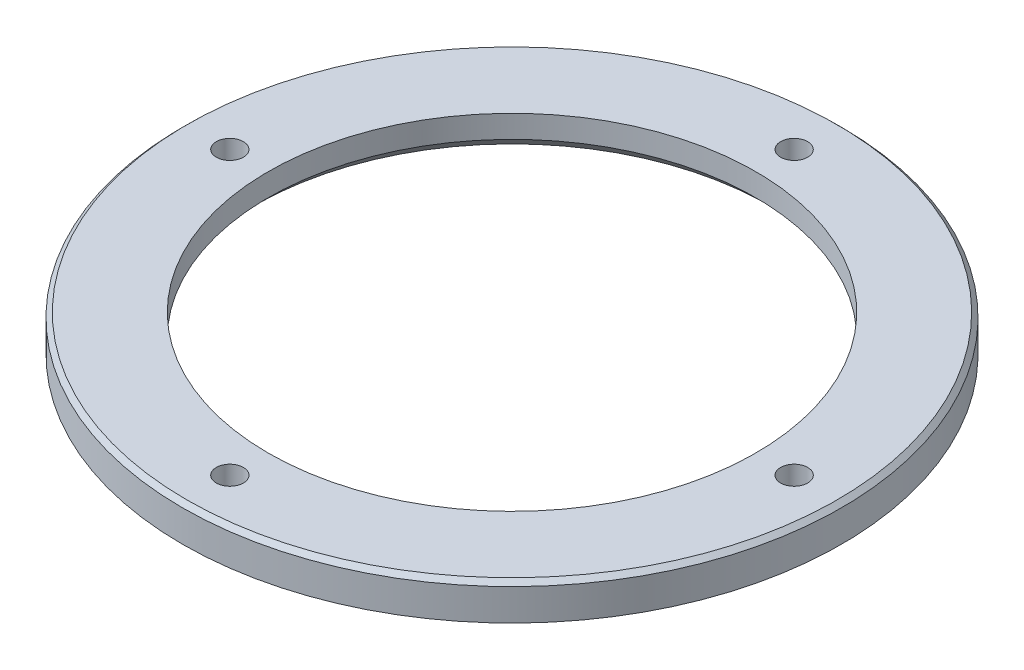
ISO-10303-21;
HEADER;
FILE_DESCRIPTION(('STEP AP214'),'2;1');
FILE_NAME('part.step','',(''),(''),'','','');
FILE_SCHEMA(('AUTOMOTIVE_DESIGN { 1 0 10303 214 1 1 1 1 }'));
ENDSEC;
DATA;
#1=APPLICATION_CONTEXT('core data for automotive mechanical design processes');
#2=APPLICATION_PROTOCOL_DEFINITION('international standard','automotive_design',2000,#1);
#3=PRODUCT_CONTEXT('',#1,'mechanical');
#4=PRODUCT('Part','Part','',(#3));
#5=PRODUCT_RELATED_PRODUCT_CATEGORY('part','',(#4));
#6=PRODUCT_DEFINITION_FORMATION('','',#4);
#7=PRODUCT_DEFINITION_CONTEXT('part definition',#1,'design');
#8=PRODUCT_DEFINITION('design','',#6,#7);
#9=PRODUCT_DEFINITION_SHAPE('','',#8);
#10=(LENGTH_UNIT() NAMED_UNIT(*) SI_UNIT(.MILLI.,.METRE.));
#11=(NAMED_UNIT(*) PLANE_ANGLE_UNIT() SI_UNIT($,.RADIAN.));
#12=(NAMED_UNIT(*) SI_UNIT($,.STERADIAN.) SOLID_ANGLE_UNIT());
#13=UNCERTAINTY_MEASURE_WITH_UNIT(LENGTH_MEASURE(1.E-05),#10,'distance_accuracy_value','');
#14=(GEOMETRIC_REPRESENTATION_CONTEXT(3) GLOBAL_UNCERTAINTY_ASSIGNED_CONTEXT((#13)) GLOBAL_UNIT_ASSIGNED_CONTEXT((#10,
#11,#12)) REPRESENTATION_CONTEXT('',''));
#15=CARTESIAN_POINT('',(0.,0.,0.));
#16=DIRECTION('',(0.,0.,1.));
#17=DIRECTION('',(1.,0.,0.));
#18=AXIS2_PLACEMENT_3D('',#15,#16,#17);
#19=CARTESIAN_POINT('',(0.,8.,0.));
#20=DIRECTION('',(0.,1.,0.));
#21=DIRECTION('',(0.,0.,1.));
#22=AXIS2_PLACEMENT_3D('',#19,#20,#21);
#23=PLANE('',#22);
#24=CARTESIAN_POINT('',(0.,8.,0.));
#25=DIRECTION('',(0.,1.,0.));
#26=DIRECTION('',(0.,0.,1.));
#27=AXIS2_PLACEMENT_3D('',#24,#25,#26);
#28=CIRCLE('',#27,72.);
#29=CARTESIAN_POINT('',(0.,8.,72.));
#30=VERTEX_POINT('',#29);
#31=EDGE_CURVE('E48',#30,#30,#28,.T.);
#32=ORIENTED_EDGE('',*,*,#31,.T.);
#33=EDGE_LOOP('',(#32));
#34=FACE_BOUND('',#33,.T.);
#35=CARTESIAN_POINT('',(62.5,8.,0.));
#36=DIRECTION('',(0.,1.,0.));
#37=DIRECTION('',(0.,0.,1.));
#38=AXIS2_PLACEMENT_3D('',#35,#36,#37);
#39=CIRCLE('',#38,3.);
#40=CARTESIAN_POINT('',(62.5,8.,3.));
#41=VERTEX_POINT('',#40);
#42=EDGE_CURVE('E58',#41,#41,#39,.T.);
#43=ORIENTED_EDGE('',*,*,#42,.F.);
#44=EDGE_LOOP('',(#43));
#45=FACE_BOUND('',#44,.T.);
#46=CARTESIAN_POINT('',(0.,8.,62.5));
#47=DIRECTION('',(0.,1.,0.));
#48=DIRECTION('',(0.,0.,1.));
#49=AXIS2_PLACEMENT_3D('',#46,#47,#48);
#50=CIRCLE('',#49,3.);
#51=CARTESIAN_POINT('',(0.,8.,65.5));
#52=VERTEX_POINT('',#51);
#53=EDGE_CURVE('E57',#52,#52,#50,.T.);
#54=ORIENTED_EDGE('',*,*,#53,.F.);
#55=EDGE_LOOP('',(#54));
#56=FACE_BOUND('',#55,.T.);
#57=CARTESIAN_POINT('',(0.,8.,-62.5));
#58=DIRECTION('',(0.,1.,0.));
#59=DIRECTION('',(0.,0.,1.));
#60=AXIS2_PLACEMENT_3D('',#57,#58,#59);
#61=CIRCLE('',#60,3.);
#62=CARTESIAN_POINT('',(0.,8.,-59.5));
#63=VERTEX_POINT('',#62);
#64=EDGE_CURVE('E62',#63,#63,#61,.T.);
#65=ORIENTED_EDGE('',*,*,#64,.F.);
#66=EDGE_LOOP('',(#65));
#67=FACE_BOUND('',#66,.T.);
#68=CARTESIAN_POINT('',(-62.5,8.,0.));
#69=DIRECTION('',(0.,1.,0.));
#70=DIRECTION('',(0.,0.,1.));
#71=AXIS2_PLACEMENT_3D('',#68,#69,#70);
#72=CIRCLE('',#71,3.00000000000001);
#73=CARTESIAN_POINT('',(-62.5,8.,3.00000000000001));
#74=VERTEX_POINT('',#73);
#75=EDGE_CURVE('E66',#74,#74,#72,.T.);
#76=ORIENTED_EDGE('',*,*,#75,.F.);
#77=EDGE_LOOP('',(#76));
#78=FACE_BOUND('',#77,.T.);
#79=CARTESIAN_POINT('',(0.,8.,0.));
#80=DIRECTION('',(0.,1.,0.));
#81=DIRECTION('',(0.,0.,1.));
#82=AXIS2_PLACEMENT_3D('',#79,#80,#81);
#83=CIRCLE('',#82,54.);
#84=CARTESIAN_POINT('',(0.,8.,54.));
#85=VERTEX_POINT('',#84);
#86=EDGE_CURVE('E70',#85,#85,#83,.T.);
#87=ORIENTED_EDGE('',*,*,#86,.F.);
#88=EDGE_LOOP('',(#87));
#89=FACE_BOUND('',#88,.T.);
#90=ADVANCED_FACE('F33',(#34,#45,#56,#67,#78,#89),#23,.T.);
#91=CARTESIAN_POINT('',(0.,0.,0.));
#92=DIRECTION('',(0.,1.,0.));
#93=DIRECTION('',(0.,0.,1.));
#94=AXIS2_PLACEMENT_3D('',#91,#92,#93);
#95=PLANE('',#94);
#96=CARTESIAN_POINT('',(0.,0.,0.));
#97=DIRECTION('',(0.,1.,0.));
#98=DIRECTION('',(0.,0.,1.));
#99=AXIS2_PLACEMENT_3D('',#96,#97,#98);
#100=CIRCLE('',#99,57.);
#101=CARTESIAN_POINT('',(0.,0.,57.));
#102=VERTEX_POINT('',#101);
#103=EDGE_CURVE('E40',#102,#102,#100,.T.);
#104=ORIENTED_EDGE('',*,*,#103,.T.);
#105=EDGE_LOOP('',(#104));
#106=FACE_BOUND('',#105,.T.);
#107=CARTESIAN_POINT('',(62.5,0.,0.));
#108=DIRECTION('',(0.,1.,0.));
#109=DIRECTION('',(0.,0.,1.));
#110=AXIS2_PLACEMENT_3D('',#107,#108,#109);
#111=CIRCLE('',#110,3.);
#112=CARTESIAN_POINT('',(62.5,0.,3.));
#113=VERTEX_POINT('',#112);
#114=EDGE_CURVE('E54',#113,#113,#111,.T.);
#115=ORIENTED_EDGE('',*,*,#114,.T.);
#116=EDGE_LOOP('',(#115));
#117=FACE_BOUND('',#116,.T.);
#118=CARTESIAN_POINT('',(0.,0.,62.5));
#119=DIRECTION('',(0.,1.,0.));
#120=DIRECTION('',(0.,0.,1.));
#121=AXIS2_PLACEMENT_3D('',#118,#119,#120);
#122=CIRCLE('',#121,3.);
#123=CARTESIAN_POINT('',(0.,0.,65.5));
#124=VERTEX_POINT('',#123);
#125=EDGE_CURVE('E59',#124,#124,#122,.T.);
#126=ORIENTED_EDGE('',*,*,#125,.T.);
#127=EDGE_LOOP('',(#126));
#128=FACE_BOUND('',#127,.T.);
#129=CARTESIAN_POINT('',(0.,0.,-62.5));
#130=DIRECTION('',(0.,1.,0.));
#131=DIRECTION('',(0.,0.,1.));
#132=AXIS2_PLACEMENT_3D('',#129,#130,#131);
#133=CIRCLE('',#132,3.);
#134=CARTESIAN_POINT('',(0.,0.,-59.5));
#135=VERTEX_POINT('',#134);
#136=EDGE_CURVE('E63',#135,#135,#133,.T.);
#137=ORIENTED_EDGE('',*,*,#136,.T.);
#138=EDGE_LOOP('',(#137));
#139=FACE_BOUND('',#138,.T.);
#140=CARTESIAN_POINT('',(-62.5,0.,0.));
#141=DIRECTION('',(0.,1.,0.));
#142=DIRECTION('',(0.,0.,1.));
#143=AXIS2_PLACEMENT_3D('',#140,#141,#142);
#144=CIRCLE('',#143,3.00000000000001);
#145=CARTESIAN_POINT('',(-62.5,0.,3.00000000000001));
#146=VERTEX_POINT('',#145);
#147=EDGE_CURVE('E67',#146,#146,#144,.T.);
#148=ORIENTED_EDGE('',*,*,#147,.T.);
#149=EDGE_LOOP('',(#148));
#150=FACE_BOUND('',#149,.T.);
#151=CARTESIAN_POINT('',(0.,0.,0.));
#152=DIRECTION('',(0.,1.,0.));
#153=DIRECTION('',(0.,0.,1.));
#154=AXIS2_PLACEMENT_3D('',#151,#152,#153);
#155=CIRCLE('',#154,73.);
#156=CARTESIAN_POINT('',(0.,0.,73.));
#157=VERTEX_POINT('',#156);
#158=EDGE_CURVE('E53',#157,#157,#155,.T.);
#159=ORIENTED_EDGE('',*,*,#158,.F.);
#160=EDGE_LOOP('',(#159));
#161=FACE_BOUND('',#160,.T.);
#162=ADVANCED_FACE('F89',(#106,#117,#128,#139,#150,#161),#95,.F.);
#163=CARTESIAN_POINT('',(0.,8.,0.));
#164=DIRECTION('',(0.,-1.,0.));
#165=DIRECTION('',(0.,0.,-1.));
#166=AXIS2_PLACEMENT_3D('',#163,#164,#165);
#167=CYLINDRICAL_SURFACE('',#166,73.);
#168=CARTESIAN_POINT('',(0.,6.99999999999997,0.));
#169=DIRECTION('',(0.,1.,0.));
#170=DIRECTION('',(0.,0.,1.));
#171=AXIS2_PLACEMENT_3D('',#168,#169,#170);
#172=CIRCLE('',#171,73.);
#173=CARTESIAN_POINT('',(0.,6.99999999999997,73.));
#174=VERTEX_POINT('',#173);
#175=EDGE_CURVE('E44',#174,#174,#172,.F.);
#176=ORIENTED_EDGE('',*,*,#175,.T.);
#177=EDGE_LOOP('',(#176));
#178=FACE_BOUND('',#177,.T.);
#179=ORIENTED_EDGE('',*,*,#158,.T.);
#180=EDGE_LOOP('',(#179));
#181=FACE_BOUND('',#180,.T.);
#182=ADVANCED_FACE('F103',(#178,#181),#167,.T.);
#183=CARTESIAN_POINT('',(0.,8.,0.));
#184=DIRECTION('',(0.,-1.,0.));
#185=DIRECTION('',(0.,0.,-1.));
#186=AXIS2_PLACEMENT_3D('',#183,#184,#185);
#187=CYLINDRICAL_SURFACE('',#186,54.);
#188=CARTESIAN_POINT('',(0.,3.,0.));
#189=DIRECTION('',(0.,1.,0.));
#190=DIRECTION('',(0.,0.,1.));
#191=AXIS2_PLACEMENT_3D('',#188,#189,#190);
#192=CIRCLE('',#191,54.);
#193=CARTESIAN_POINT('',(0.,3.,54.));
#194=VERTEX_POINT('',#193);
#195=EDGE_CURVE('E10',#194,#194,#192,.F.);
#196=ORIENTED_EDGE('',*,*,#195,.T.);
#197=EDGE_LOOP('',(#196));
#198=FACE_BOUND('',#197,.T.);
#199=ORIENTED_EDGE('',*,*,#86,.T.);
#200=EDGE_LOOP('',(#199));
#201=FACE_BOUND('',#200,.T.);
#202=ADVANCED_FACE('F100',(#198,#201),#187,.F.);
#203=CARTESIAN_POINT('',(-62.5,-2.,0.));
#204=DIRECTION('',(0.,1.,0.));
#205=DIRECTION('',(0.,0.,1.));
#206=AXIS2_PLACEMENT_3D('',#203,#204,#205);
#207=CYLINDRICAL_SURFACE('',#206,3.00000000000001);
#208=ORIENTED_EDGE('',*,*,#75,.T.);
#209=EDGE_LOOP('',(#208));
#210=FACE_BOUND('',#209,.T.);
#211=ORIENTED_EDGE('',*,*,#147,.F.);
#212=EDGE_LOOP('',(#211));
#213=FACE_BOUND('',#212,.T.);
#214=ADVANCED_FACE('F102',(#210,#213),#207,.F.);
#215=CARTESIAN_POINT('',(0.,-2.,-62.5));
#216=DIRECTION('',(0.,1.,0.));
#217=DIRECTION('',(0.,0.,1.));
#218=AXIS2_PLACEMENT_3D('',#215,#216,#217);
#219=CYLINDRICAL_SURFACE('',#218,3.);
#220=ORIENTED_EDGE('',*,*,#64,.T.);
#221=EDGE_LOOP('',(#220));
#222=FACE_BOUND('',#221,.T.);
#223=ORIENTED_EDGE('',*,*,#136,.F.);
#224=EDGE_LOOP('',(#223));
#225=FACE_BOUND('',#224,.T.);
#226=ADVANCED_FACE('F109',(#222,#225),#219,.F.);
#227=CARTESIAN_POINT('',(0.,-2.,62.5));
#228=DIRECTION('',(0.,1.,0.));
#229=DIRECTION('',(0.,0.,1.));
#230=AXIS2_PLACEMENT_3D('',#227,#228,#229);
#231=CYLINDRICAL_SURFACE('',#230,3.);
#232=ORIENTED_EDGE('',*,*,#53,.T.);
#233=EDGE_LOOP('',(#232));
#234=FACE_BOUND('',#233,.T.);
#235=ORIENTED_EDGE('',*,*,#125,.F.);
#236=EDGE_LOOP('',(#235));
#237=FACE_BOUND('',#236,.T.);
#238=ADVANCED_FACE('F125',(#234,#237),#231,.F.);
#239=CARTESIAN_POINT('',(62.5,-2.,0.));
#240=DIRECTION('',(0.,1.,0.));
#241=DIRECTION('',(0.,0.,1.));
#242=AXIS2_PLACEMENT_3D('',#239,#240,#241);
#243=CYLINDRICAL_SURFACE('',#242,3.);
#244=ORIENTED_EDGE('',*,*,#42,.T.);
#245=EDGE_LOOP('',(#244));
#246=FACE_BOUND('',#245,.T.);
#247=ORIENTED_EDGE('',*,*,#114,.F.);
#248=EDGE_LOOP('',(#247));
#249=FACE_BOUND('',#248,.T.);
#250=ADVANCED_FACE('F84',(#246,#249),#243,.F.);
#251=CARTESIAN_POINT('',(0.,8.,0.));
#252=DIRECTION('',(0.,-1.,0.));
#253=DIRECTION('',(0.,0.,-1.));
#254=AXIS2_PLACEMENT_3D('',#251,#252,#253);
#255=CONICAL_SURFACE('',#254,72.,0.785398163397455);
#256=ORIENTED_EDGE('',*,*,#175,.F.);
#257=EDGE_LOOP('',(#256));
#258=FACE_BOUND('',#257,.T.);
#259=ORIENTED_EDGE('',*,*,#31,.F.);
#260=EDGE_LOOP('',(#259));
#261=FACE_BOUND('',#260,.T.);
#262=ADVANCED_FACE('F117',(#258,#261),#255,.T.);
#263=CARTESIAN_POINT('',(0.,0.,0.));
#264=DIRECTION('',(0.,-1.,0.));
#265=DIRECTION('',(0.,0.,-1.));
#266=AXIS2_PLACEMENT_3D('',#263,#264,#265);
#267=CONICAL_SURFACE('',#266,57.,0.785398163397446);
#268=ORIENTED_EDGE('',*,*,#195,.F.);
#269=EDGE_LOOP('',(#268));
#270=FACE_BOUND('',#269,.T.);
#271=ORIENTED_EDGE('',*,*,#103,.F.);
#272=EDGE_LOOP('',(#271));
#273=FACE_BOUND('',#272,.T.);
#274=ADVANCED_FACE('F35',(#270,#273),#267,.F.);
#275=CLOSED_SHELL('',(#90,#162,#182,#202,#214,#226,#238,#250,#262,#274));
#276=MANIFOLD_SOLID_BREP('B2',#275);
#277=ADVANCED_BREP_SHAPE_REPRESENTATION('',(#18,#276),#14);
#278=SHAPE_DEFINITION_REPRESENTATION(#9,#277);
ENDSEC;
END-ISO-10303-21;
